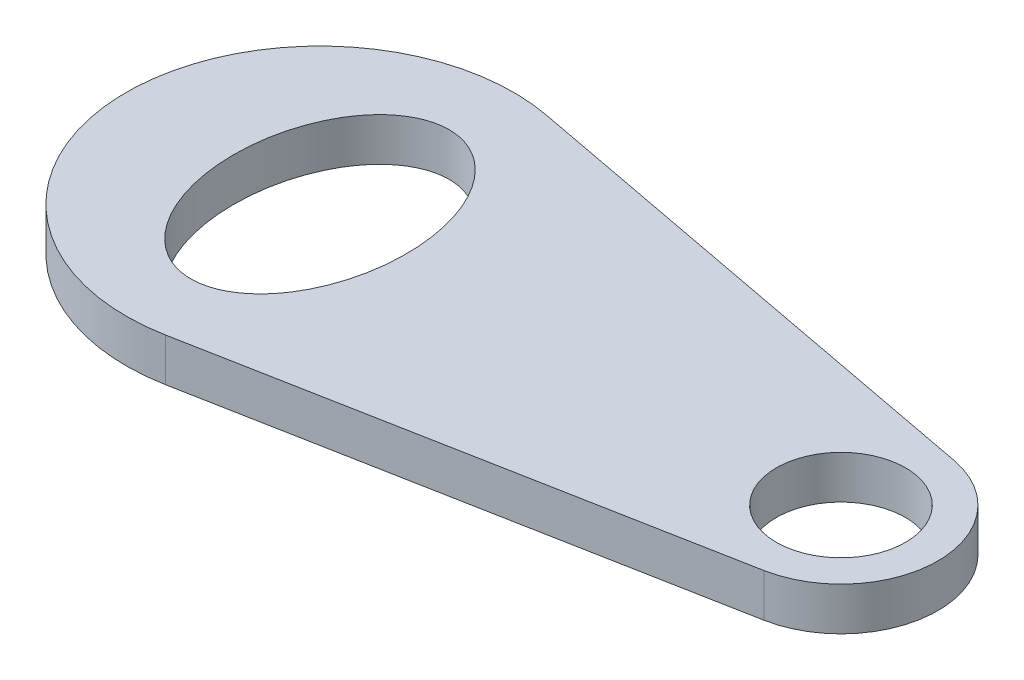
ISO-10303-21;
HEADER;
FILE_DESCRIPTION(('STEP AP214'),'2;1');
FILE_NAME('part.step','',(''),(''),'','','');
FILE_SCHEMA(('AUTOMOTIVE_DESIGN { 1 0 10303 214 1 1 1 1 }'));
ENDSEC;
DATA;
#1=APPLICATION_CONTEXT('core data for automotive mechanical design processes');
#2=APPLICATION_PROTOCOL_DEFINITION('international standard','automotive_design',2000,#1);
#3=PRODUCT_CONTEXT('',#1,'mechanical');
#4=PRODUCT('Part','Part','',(#3));
#5=PRODUCT_RELATED_PRODUCT_CATEGORY('part','',(#4));
#6=PRODUCT_DEFINITION_FORMATION('','',#4);
#7=PRODUCT_DEFINITION_CONTEXT('part definition',#1,'design');
#8=PRODUCT_DEFINITION('design','',#6,#7);
#9=PRODUCT_DEFINITION_SHAPE('','',#8);
#10=(LENGTH_UNIT() NAMED_UNIT(*) SI_UNIT(.MILLI.,.METRE.));
#11=(NAMED_UNIT(*) PLANE_ANGLE_UNIT() SI_UNIT($,.RADIAN.));
#12=(NAMED_UNIT(*) SI_UNIT($,.STERADIAN.) SOLID_ANGLE_UNIT());
#13=UNCERTAINTY_MEASURE_WITH_UNIT(LENGTH_MEASURE(1.E-05),#10,'distance_accuracy_value','');
#14=(GEOMETRIC_REPRESENTATION_CONTEXT(3) GLOBAL_UNCERTAINTY_ASSIGNED_CONTEXT((#13)) GLOBAL_UNIT_ASSIGNED_CONTEXT((#10,
#11,#12)) REPRESENTATION_CONTEXT('',''));
#15=CARTESIAN_POINT('',(0.,0.,0.));
#16=DIRECTION('',(0.,0.,1.));
#17=DIRECTION('',(1.,0.,0.));
#18=AXIS2_PLACEMENT_3D('',#15,#16,#17);
#19=CARTESIAN_POINT('',(-42.8144394767345,10.,0.));
#20=DIRECTION('',(0.,1.,0.));
#21=DIRECTION('',(0.,0.,1.));
#22=AXIS2_PLACEMENT_3D('',#19,#20,#21);
#23=PLANE('',#22);
#24=CARTESIAN_POINT('',(78.1591255217791,10.,0.));
#25=DIRECTION('',(0.,1.,0.));
#26=DIRECTION('',(0.,0.,1.));
#27=AXIS2_PLACEMENT_3D('',#24,#25,#26);
#28=CIRCLE('',#27,15.);
#29=CARTESIAN_POINT('',(78.1591255217791,10.,15.));
#30=VERTEX_POINT('',#29);
#31=EDGE_CURVE('E110',#30,#30,#28,.T.);
#32=ORIENTED_EDGE('',*,*,#31,.F.);
#33=EDGE_LOOP('',(#32));
#34=FACE_BOUND('',#33,.T.);
#35=CARTESIAN_POINT('',(-42.8144394767345,10.,0.));
#36=DIRECTION('',(0.,1.,0.));
#37=DIRECTION('',(0.,0.,1.));
#38=AXIS2_PLACEMENT_3D('',#35,#36,#37);
#39=CIRCLE('',#38,45.);
#40=CARTESIAN_POINT('',(-34.4448423667176,10.,-44.2148147594898));
#41=VERTEX_POINT('',#40);
#42=CARTESIAN_POINT('',(-34.4448423667176,10.,44.2148147594898));
#43=VERTEX_POINT('',#42);
#44=EDGE_CURVE('E95',#41,#43,#39,.T.);
#45=ORIENTED_EDGE('',*,*,#44,.T.);
#46=DIRECTION('',(0.982551439099774,0.,-0.185991046889263));
#47=VECTOR('',#46,1.);
#48=CARTESIAN_POINT('',(-34.4448423667176,10.,44.2148147594898));
#49=LINE('',#48,#47);
#50=CARTESIAN_POINT('',(82.3439240767885,10.,22.1074073797449));
#51=VERTEX_POINT('',#50);
#52=EDGE_CURVE('E90',#43,#51,#49,.T.);
#53=ORIENTED_EDGE('',*,*,#52,.T.);
#54=CARTESIAN_POINT('',(78.1591255217791,10.,0.));
#55=DIRECTION('',(0.,1.,0.));
#56=DIRECTION('',(0.,0.,1.));
#57=AXIS2_PLACEMENT_3D('',#54,#55,#56);
#58=CIRCLE('',#57,22.5000000000002);
#59=CARTESIAN_POINT('',(82.3439240767885,10.,-22.1074073797449));
#60=VERTEX_POINT('',#59);
#61=EDGE_CURVE('E93',#51,#60,#58,.T.);
#62=ORIENTED_EDGE('',*,*,#61,.T.);
#63=DIRECTION('',(-0.982551439099774,0.,-0.185991046889263));
#64=VECTOR('',#63,1.);
#65=CARTESIAN_POINT('',(-34.4448423667176,10.,-44.2148147594898));
#66=LINE('',#65,#64);
#67=EDGE_CURVE('E60',#60,#41,#66,.T.);
#68=ORIENTED_EDGE('',*,*,#67,.T.);
#69=EDGE_LOOP('',(#45,#53,#62,#68));
#70=FACE_BOUND('',#69,.T.);
#71=CARTESIAN_POINT('',(-42.8144394767345,10.,0.));
#72=DIRECTION('',(0.,1.,0.));
#73=DIRECTION('',(0.,0.,-1.));
#74=AXIS2_PLACEMENT_3D('',#71,#72,#73);
#75=ELLIPSE('',#74,30.,20.);
#76=CARTESIAN_POINT('',(-42.8144394767345,10.,-30.));
#77=VERTEX_POINT('',#76);
#78=EDGE_CURVE('E125',#77,#77,#75,.T.);
#79=ORIENTED_EDGE('',*,*,#78,.F.);
#80=EDGE_LOOP('',(#79));
#81=FACE_BOUND('',#80,.T.);
#82=ADVANCED_FACE('F43',(#34,#70,#81),#23,.T.);
#83=CARTESIAN_POINT('',(-42.8144394767345,0.,0.));
#84=DIRECTION('',(0.,1.,0.));
#85=DIRECTION('',(0.,0.,1.));
#86=AXIS2_PLACEMENT_3D('',#83,#84,#85);
#87=PLANE('',#86);
#88=CARTESIAN_POINT('',(-42.8144394767345,0.,0.));
#89=DIRECTION('',(0.,1.,0.));
#90=DIRECTION('',(0.,0.,1.));
#91=AXIS2_PLACEMENT_3D('',#88,#89,#90);
#92=CIRCLE('',#91,45.);
#93=CARTESIAN_POINT('',(-34.4448423667176,0.,-44.2148147594898));
#94=VERTEX_POINT('',#93);
#95=CARTESIAN_POINT('',(-34.4448423667176,0.,44.2148147594898));
#96=VERTEX_POINT('',#95);
#97=EDGE_CURVE('E107',#94,#96,#92,.T.);
#98=ORIENTED_EDGE('',*,*,#97,.F.);
#99=DIRECTION('',(-0.982551439099774,0.,-0.185991046889263));
#100=VECTOR('',#99,1.);
#101=CARTESIAN_POINT('',(-34.4448423667176,0.,-44.2148147594898));
#102=LINE('',#101,#100);
#103=CARTESIAN_POINT('',(82.3439240767885,0.,-22.1074073797449));
#104=VERTEX_POINT('',#103);
#105=EDGE_CURVE('E83',#104,#94,#102,.T.);
#106=ORIENTED_EDGE('',*,*,#105,.F.);
#107=CARTESIAN_POINT('',(78.1591255217791,0.,0.));
#108=DIRECTION('',(0.,1.,0.));
#109=DIRECTION('',(0.,0.,1.));
#110=AXIS2_PLACEMENT_3D('',#107,#108,#109);
#111=CIRCLE('',#110,22.5000000000002);
#112=CARTESIAN_POINT('',(82.3439240767885,0.,22.1074073797449));
#113=VERTEX_POINT('',#112);
#114=EDGE_CURVE('E77',#113,#104,#111,.T.);
#115=ORIENTED_EDGE('',*,*,#114,.F.);
#116=DIRECTION('',(0.982551439099774,0.,-0.185991046889263));
#117=VECTOR('',#116,1.);
#118=CARTESIAN_POINT('',(-34.4448423667176,0.,44.2148147594898));
#119=LINE('',#118,#117);
#120=EDGE_CURVE('E99',#96,#113,#119,.T.);
#121=ORIENTED_EDGE('',*,*,#120,.F.);
#122=EDGE_LOOP('',(#98,#106,#115,#121));
#123=FACE_BOUND('',#122,.T.);
#124=CARTESIAN_POINT('',(78.1591255217791,0.,0.));
#125=DIRECTION('',(0.,1.,0.));
#126=DIRECTION('',(0.,0.,1.));
#127=AXIS2_PLACEMENT_3D('',#124,#125,#126);
#128=CIRCLE('',#127,15.);
#129=CARTESIAN_POINT('',(78.1591255217791,0.,15.));
#130=VERTEX_POINT('',#129);
#131=EDGE_CURVE('E122',#130,#130,#128,.T.);
#132=ORIENTED_EDGE('',*,*,#131,.T.);
#133=EDGE_LOOP('',(#132));
#134=FACE_BOUND('',#133,.T.);
#135=CARTESIAN_POINT('',(-42.8144394767345,0.,0.));
#136=DIRECTION('',(0.,1.,0.));
#137=DIRECTION('',(0.,0.,-1.));
#138=AXIS2_PLACEMENT_3D('',#135,#136,#137);
#139=ELLIPSE('',#138,30.,20.);
#140=CARTESIAN_POINT('',(-42.8144394767345,0.,-30.));
#141=VERTEX_POINT('',#140);
#142=EDGE_CURVE('E128',#141,#141,#139,.T.);
#143=ORIENTED_EDGE('',*,*,#142,.T.);
#144=EDGE_LOOP('',(#143));
#145=FACE_BOUND('',#144,.T.);
#146=ADVANCED_FACE('F118',(#123,#134,#145),#87,.F.);
#147=CARTESIAN_POINT('',(-42.8144394767345,10.,0.));
#148=DIRECTION('',(0.,-1.,0.));
#149=DIRECTION('',(0.,0.,-1.));
#150=AXIS2_PLACEMENT_3D('',#147,#148,#149);
#151=CYLINDRICAL_SURFACE('',#150,45.);
#152=ORIENTED_EDGE('',*,*,#97,.T.);
#153=DIRECTION('',(0.,-1.,0.));
#154=VECTOR('',#153,1.);
#155=CARTESIAN_POINT('',(-34.4448423667176,10.,44.2148147594898));
#156=LINE('',#155,#154);
#157=EDGE_CURVE('E11',#43,#96,#156,.T.);
#158=ORIENTED_EDGE('',*,*,#157,.F.);
#159=ORIENTED_EDGE('',*,*,#44,.F.);
#160=DIRECTION('',(0.,-1.,0.));
#161=VECTOR('',#160,1.);
#162=CARTESIAN_POINT('',(-34.4448423667176,10.,-44.2148147594898));
#163=LINE('',#162,#161);
#164=EDGE_CURVE('E103',#41,#94,#163,.T.);
#165=ORIENTED_EDGE('',*,*,#164,.T.);
#166=EDGE_LOOP('',(#152,#158,#159,#165));
#167=FACE_BOUND('',#166,.T.);
#168=ADVANCED_FACE('F45',(#167),#151,.T.);
#169=CARTESIAN_POINT('',(-34.4448423667176,10.,44.2148147594898));
#170=DIRECTION('',(-0.185991046889263,0.,-0.982551439099774));
#171=DIRECTION('',(-0.982551439099774,0.,0.185991046889263));
#172=AXIS2_PLACEMENT_3D('',#169,#170,#171);
#173=PLANE('',#172);
#174=ORIENTED_EDGE('',*,*,#120,.T.);
#175=DIRECTION('',(0.,-1.,0.));
#176=VECTOR('',#175,1.);
#177=CARTESIAN_POINT('',(82.3439240767885,10.,22.1074073797449));
#178=LINE('',#177,#176);
#179=EDGE_CURVE('E52',#51,#113,#178,.T.);
#180=ORIENTED_EDGE('',*,*,#179,.F.);
#181=ORIENTED_EDGE('',*,*,#52,.F.);
#182=ORIENTED_EDGE('',*,*,#157,.T.);
#183=EDGE_LOOP('',(#174,#180,#181,#182));
#184=FACE_BOUND('',#183,.T.);
#185=ADVANCED_FACE('F98',(#184),#173,.F.);
#186=CARTESIAN_POINT('',(78.1591255217791,10.,0.));
#187=DIRECTION('',(0.,-1.,0.));
#188=DIRECTION('',(0.,0.,-1.));
#189=AXIS2_PLACEMENT_3D('',#186,#187,#188);
#190=CYLINDRICAL_SURFACE('',#189,22.5000000000002);
#191=ORIENTED_EDGE('',*,*,#114,.T.);
#192=DIRECTION('',(0.,-1.,0.));
#193=VECTOR('',#192,1.);
#194=CARTESIAN_POINT('',(82.3439240767885,10.,-22.1074073797449));
#195=LINE('',#194,#193);
#196=EDGE_CURVE('E100',#60,#104,#195,.T.);
#197=ORIENTED_EDGE('',*,*,#196,.F.);
#198=ORIENTED_EDGE('',*,*,#61,.F.);
#199=ORIENTED_EDGE('',*,*,#179,.T.);
#200=EDGE_LOOP('',(#191,#197,#198,#199));
#201=FACE_BOUND('',#200,.T.);
#202=ADVANCED_FACE('F101',(#201),#190,.T.);
#203=CARTESIAN_POINT('',(-34.4448423667176,10.,-44.2148147594898));
#204=DIRECTION('',(-0.185991046889263,0.,0.982551439099774));
#205=DIRECTION('',(0.982551439099774,0.,0.185991046889263));
#206=AXIS2_PLACEMENT_3D('',#203,#204,#205);
#207=PLANE('',#206);
#208=ORIENTED_EDGE('',*,*,#105,.T.);
#209=ORIENTED_EDGE('',*,*,#164,.F.);
#210=ORIENTED_EDGE('',*,*,#67,.F.);
#211=ORIENTED_EDGE('',*,*,#196,.T.);
#212=EDGE_LOOP('',(#208,#209,#210,#211));
#213=FACE_BOUND('',#212,.T.);
#214=ADVANCED_FACE('F115',(#213),#207,.F.);
#215=CARTESIAN_POINT('',(78.1591255217791,10.,0.));
#216=DIRECTION('',(0.,-1.,0.));
#217=DIRECTION('',(0.,0.,-1.));
#218=AXIS2_PLACEMENT_3D('',#215,#216,#217);
#219=CYLINDRICAL_SURFACE('',#218,15.);
#220=ORIENTED_EDGE('',*,*,#31,.T.);
#221=EDGE_LOOP('',(#220));
#222=FACE_BOUND('',#221,.T.);
#223=ORIENTED_EDGE('',*,*,#131,.F.);
#224=EDGE_LOOP('',(#223));
#225=FACE_BOUND('',#224,.T.);
#226=ADVANCED_FACE('F137',(#222,#225),#219,.F.);
#227=DIRECTION('',(0.,-1.,0.));
#228=VECTOR('',#227,1.);
#229=SURFACE_OF_LINEAR_EXTRUSION('',#75,#228);
#230=ORIENTED_EDGE('',*,*,#78,.T.);
#231=EDGE_LOOP('',(#230));
#232=FACE_BOUND('',#231,.T.);
#233=ORIENTED_EDGE('',*,*,#142,.F.);
#234=EDGE_LOOP('',(#233));
#235=FACE_BOUND('',#234,.T.);
#236=ADVANCED_FACE('F134',(#232,#235),#229,.T.);
#237=CLOSED_SHELL('',(#82,#146,#168,#185,#202,#214,#226,#236));
#238=MANIFOLD_SOLID_BREP('B2',#237);
#239=ADVANCED_BREP_SHAPE_REPRESENTATION('',(#18,#238),#14);
#240=SHAPE_DEFINITION_REPRESENTATION(#9,#239);
ENDSEC;
END-ISO-10303-21;
